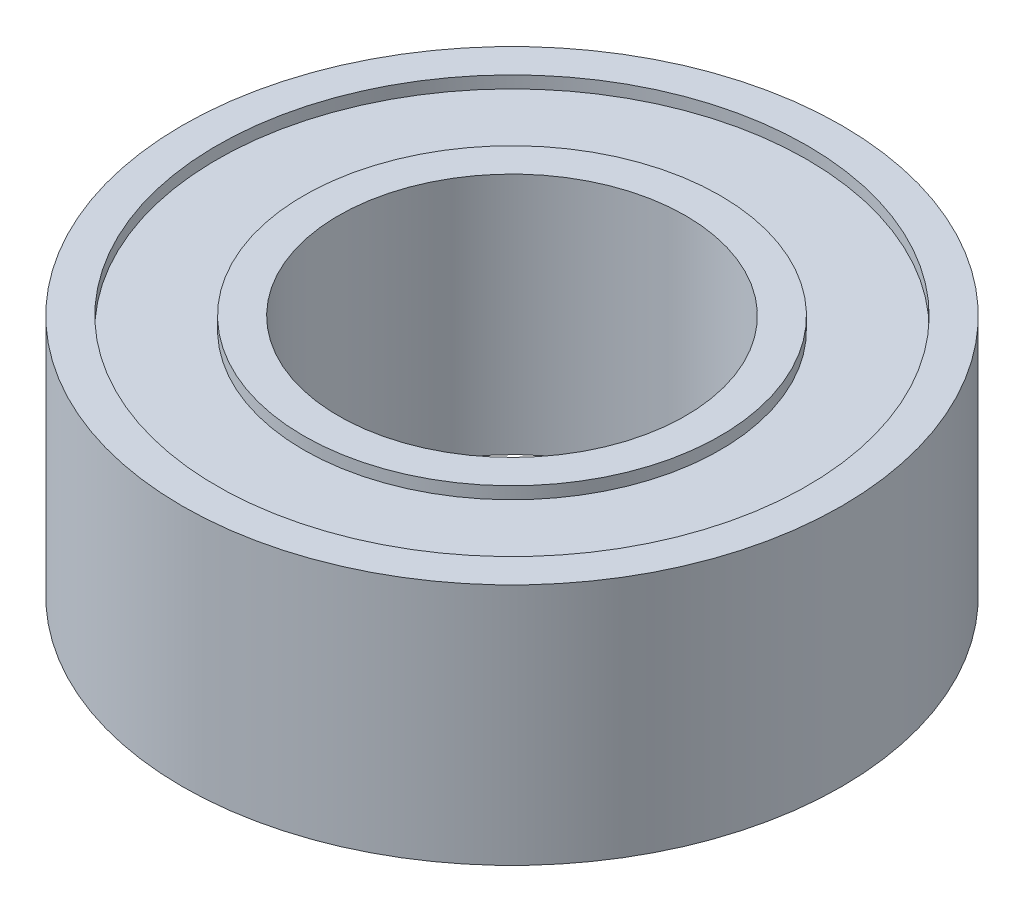
ISO-10303-21;
HEADER;
FILE_DESCRIPTION(('STEP AP214'),'2;1');
FILE_NAME('part.step','',(''),(''),'','','');
FILE_SCHEMA(('AUTOMOTIVE_DESIGN { 1 0 10303 214 1 1 1 1 }'));
ENDSEC;
DATA;
#1=APPLICATION_CONTEXT('core data for automotive mechanical design processes');
#2=APPLICATION_PROTOCOL_DEFINITION('international standard','automotive_design',2000,#1);
#3=PRODUCT_CONTEXT('',#1,'mechanical');
#4=PRODUCT('Part','Part','',(#3));
#5=PRODUCT_RELATED_PRODUCT_CATEGORY('part','',(#4));
#6=PRODUCT_DEFINITION_FORMATION('','',#4);
#7=PRODUCT_DEFINITION_CONTEXT('part definition',#1,'design');
#8=PRODUCT_DEFINITION('design','',#6,#7);
#9=PRODUCT_DEFINITION_SHAPE('','',#8);
#10=(LENGTH_UNIT() NAMED_UNIT(*) SI_UNIT(.MILLI.,.METRE.));
#11=(NAMED_UNIT(*) PLANE_ANGLE_UNIT() SI_UNIT($,.RADIAN.));
#12=(NAMED_UNIT(*) SI_UNIT($,.STERADIAN.) SOLID_ANGLE_UNIT());
#13=UNCERTAINTY_MEASURE_WITH_UNIT(LENGTH_MEASURE(1.E-05),#10,'distance_accuracy_value','');
#14=(GEOMETRIC_REPRESENTATION_CONTEXT(3) GLOBAL_UNCERTAINTY_ASSIGNED_CONTEXT((#13)) GLOBAL_UNIT_ASSIGNED_CONTEXT((#10,
#11,#12)) REPRESENTATION_CONTEXT('',''));
#15=CARTESIAN_POINT('',(0.,0.,0.));
#16=DIRECTION('',(0.,0.,1.));
#17=DIRECTION('',(1.,0.,0.));
#18=AXIS2_PLACEMENT_3D('',#15,#16,#17);
#19=CARTESIAN_POINT('',(5.,3.5,0.));
#20=DIRECTION('',(0.,1.,0.));
#21=DIRECTION('',(0.,0.,1.));
#22=AXIS2_PLACEMENT_3D('',#19,#20,#21);
#23=PLANE('',#22);
#24=CARTESIAN_POINT('',(0.,3.5,0.));
#25=DIRECTION('',(0.,-1.,0.));
#26=DIRECTION('',(0.,0.,-1.));
#27=AXIS2_PLACEMENT_3D('',#24,#25,#26);
#28=CIRCLE('',#27,5.);
#29=CARTESIAN_POINT('',(0.,3.5,-5.));
#30=VERTEX_POINT('',#29);
#31=EDGE_CURVE('E83',#30,#30,#28,.T.);
#32=ORIENTED_EDGE('',*,*,#31,.T.);
#33=EDGE_LOOP('',(#32));
#34=FACE_BOUND('',#33,.T.);
#35=CARTESIAN_POINT('',(0.,3.5,0.));
#36=DIRECTION('',(0.,-1.,0.));
#37=DIRECTION('',(0.,0.,-1.));
#38=AXIS2_PLACEMENT_3D('',#35,#36,#37);
#39=CIRCLE('',#38,6.);
#40=CARTESIAN_POINT('',(0.,3.5,-6.));
#41=VERTEX_POINT('',#40);
#42=EDGE_CURVE('E10',#41,#41,#39,.T.);
#43=ORIENTED_EDGE('',*,*,#42,.F.);
#44=EDGE_LOOP('',(#43));
#45=FACE_BOUND('',#44,.T.);
#46=ADVANCED_FACE('F44',(#34,#45),#23,.T.);
#47=CARTESIAN_POINT('',(0.,0.,0.));
#48=DIRECTION('',(0.,-1.,0.));
#49=DIRECTION('',(0.,0.,-1.));
#50=AXIS2_PLACEMENT_3D('',#47,#48,#49);
#51=CYLINDRICAL_SURFACE('',#50,6.);
#52=ORIENTED_EDGE('',*,*,#42,.T.);
#53=EDGE_LOOP('',(#52));
#54=FACE_BOUND('',#53,.T.);
#55=CARTESIAN_POINT('',(0.,3.15,0.));
#56=DIRECTION('',(0.,-1.,0.));
#57=DIRECTION('',(0.,0.,-1.));
#58=AXIS2_PLACEMENT_3D('',#55,#56,#57);
#59=CIRCLE('',#58,6.);
#60=CARTESIAN_POINT('',(0.,3.15,-6.));
#61=VERTEX_POINT('',#60);
#62=EDGE_CURVE('E51',#61,#61,#59,.T.);
#63=ORIENTED_EDGE('',*,*,#62,.F.);
#64=EDGE_LOOP('',(#63));
#65=FACE_BOUND('',#64,.T.);
#66=ADVANCED_FACE('F103',(#54,#65),#51,.T.);
#67=CARTESIAN_POINT('',(6.,3.15,0.));
#68=DIRECTION('',(0.,1.,0.));
#69=DIRECTION('',(0.,0.,1.));
#70=AXIS2_PLACEMENT_3D('',#67,#68,#69);
#71=PLANE('',#70);
#72=ORIENTED_EDGE('',*,*,#62,.T.);
#73=EDGE_LOOP('',(#72));
#74=FACE_BOUND('',#73,.T.);
#75=CARTESIAN_POINT('',(0.,3.15,0.));
#76=DIRECTION('',(0.,-1.,0.));
#77=DIRECTION('',(0.,0.,-1.));
#78=AXIS2_PLACEMENT_3D('',#75,#76,#77);
#79=CIRCLE('',#78,8.5);
#80=CARTESIAN_POINT('',(0.,3.15,-8.5));
#81=VERTEX_POINT('',#80);
#82=EDGE_CURVE('E54',#81,#81,#79,.T.);
#83=ORIENTED_EDGE('',*,*,#82,.F.);
#84=EDGE_LOOP('',(#83));
#85=FACE_BOUND('',#84,.T.);
#86=ADVANCED_FACE('F110',(#74,#85),#71,.T.);
#87=CARTESIAN_POINT('',(0.,0.,0.));
#88=DIRECTION('',(0.,-1.,0.));
#89=DIRECTION('',(0.,0.,-1.));
#90=AXIS2_PLACEMENT_3D('',#87,#88,#89);
#91=CYLINDRICAL_SURFACE('',#90,8.5);
#92=ORIENTED_EDGE('',*,*,#82,.T.);
#93=EDGE_LOOP('',(#92));
#94=FACE_BOUND('',#93,.T.);
#95=CARTESIAN_POINT('',(0.,3.5,0.));
#96=DIRECTION('',(0.,-1.,0.));
#97=DIRECTION('',(0.,0.,-1.));
#98=AXIS2_PLACEMENT_3D('',#95,#96,#97);
#99=CIRCLE('',#98,8.5);
#100=CARTESIAN_POINT('',(0.,3.5,-8.5));
#101=VERTEX_POINT('',#100);
#102=EDGE_CURVE('E56',#101,#101,#99,.T.);
#103=ORIENTED_EDGE('',*,*,#102,.F.);
#104=EDGE_LOOP('',(#103));
#105=FACE_BOUND('',#104,.T.);
#106=ADVANCED_FACE('F115',(#94,#105),#91,.F.);
#107=CARTESIAN_POINT('',(8.5,3.5,0.));
#108=DIRECTION('',(0.,1.,0.));
#109=DIRECTION('',(0.,0.,1.));
#110=AXIS2_PLACEMENT_3D('',#107,#108,#109);
#111=PLANE('',#110);
#112=ORIENTED_EDGE('',*,*,#102,.T.);
#113=EDGE_LOOP('',(#112));
#114=FACE_BOUND('',#113,.T.);
#115=CARTESIAN_POINT('',(0.,3.5,0.));
#116=DIRECTION('',(0.,-1.,0.));
#117=DIRECTION('',(0.,0.,-1.));
#118=AXIS2_PLACEMENT_3D('',#115,#116,#117);
#119=CIRCLE('',#118,9.5);
#120=CARTESIAN_POINT('',(0.,3.5,-9.5));
#121=VERTEX_POINT('',#120);
#122=EDGE_CURVE('E63',#121,#121,#119,.T.);
#123=ORIENTED_EDGE('',*,*,#122,.F.);
#124=EDGE_LOOP('',(#123));
#125=FACE_BOUND('',#124,.T.);
#126=ADVANCED_FACE('F119',(#114,#125),#111,.T.);
#127=CARTESIAN_POINT('',(0.,0.,0.));
#128=DIRECTION('',(0.,-1.,0.));
#129=DIRECTION('',(0.,0.,-1.));
#130=AXIS2_PLACEMENT_3D('',#127,#128,#129);
#131=CYLINDRICAL_SURFACE('',#130,9.5);
#132=ORIENTED_EDGE('',*,*,#122,.T.);
#133=EDGE_LOOP('',(#132));
#134=FACE_BOUND('',#133,.T.);
#135=CARTESIAN_POINT('',(0.,-3.5,0.));
#136=DIRECTION('',(0.,-1.,0.));
#137=DIRECTION('',(0.,0.,-1.));
#138=AXIS2_PLACEMENT_3D('',#135,#136,#137);
#139=CIRCLE('',#138,9.5);
#140=CARTESIAN_POINT('',(0.,-3.5,-9.5));
#141=VERTEX_POINT('',#140);
#142=EDGE_CURVE('E70',#141,#141,#139,.T.);
#143=ORIENTED_EDGE('',*,*,#142,.F.);
#144=EDGE_LOOP('',(#143));
#145=FACE_BOUND('',#144,.T.);
#146=ADVANCED_FACE('F125',(#134,#145),#131,.T.);
#147=CARTESIAN_POINT('',(8.5,-3.5,0.));
#148=DIRECTION('',(0.,-1.,0.));
#149=DIRECTION('',(0.,0.,-1.));
#150=AXIS2_PLACEMENT_3D('',#147,#148,#149);
#151=PLANE('',#150);
#152=ORIENTED_EDGE('',*,*,#142,.T.);
#153=EDGE_LOOP('',(#152));
#154=FACE_BOUND('',#153,.T.);
#155=CARTESIAN_POINT('',(0.,-3.5,0.));
#156=DIRECTION('',(0.,-1.,0.));
#157=DIRECTION('',(0.,0.,-1.));
#158=AXIS2_PLACEMENT_3D('',#155,#156,#157);
#159=CIRCLE('',#158,8.5);
#160=CARTESIAN_POINT('',(0.,-3.5,-8.5));
#161=VERTEX_POINT('',#160);
#162=EDGE_CURVE('E68',#161,#161,#159,.T.);
#163=ORIENTED_EDGE('',*,*,#162,.F.);
#164=EDGE_LOOP('',(#163));
#165=FACE_BOUND('',#164,.T.);
#166=ADVANCED_FACE('F127',(#154,#165),#151,.T.);
#167=CARTESIAN_POINT('',(0.,0.,0.));
#168=DIRECTION('',(0.,-1.,0.));
#169=DIRECTION('',(0.,0.,-1.));
#170=AXIS2_PLACEMENT_3D('',#167,#168,#169);
#171=CYLINDRICAL_SURFACE('',#170,8.5);
#172=ORIENTED_EDGE('',*,*,#162,.T.);
#173=EDGE_LOOP('',(#172));
#174=FACE_BOUND('',#173,.T.);
#175=CARTESIAN_POINT('',(0.,-3.15,0.));
#176=DIRECTION('',(0.,-1.,0.));
#177=DIRECTION('',(0.,0.,-1.));
#178=AXIS2_PLACEMENT_3D('',#175,#176,#177);
#179=CIRCLE('',#178,8.5);
#180=CARTESIAN_POINT('',(0.,-3.15,-8.5));
#181=VERTEX_POINT('',#180);
#182=EDGE_CURVE('E71',#181,#181,#179,.T.);
#183=ORIENTED_EDGE('',*,*,#182,.F.);
#184=EDGE_LOOP('',(#183));
#185=FACE_BOUND('',#184,.T.);
#186=ADVANCED_FACE('F128',(#174,#185),#171,.F.);
#187=CARTESIAN_POINT('',(6.,-3.15,0.));
#188=DIRECTION('',(0.,-1.,0.));
#189=DIRECTION('',(0.,0.,-1.));
#190=AXIS2_PLACEMENT_3D('',#187,#188,#189);
#191=PLANE('',#190);
#192=ORIENTED_EDGE('',*,*,#182,.T.);
#193=EDGE_LOOP('',(#192));
#194=FACE_BOUND('',#193,.T.);
#195=CARTESIAN_POINT('',(0.,-3.15,0.));
#196=DIRECTION('',(0.,-1.,0.));
#197=DIRECTION('',(0.,0.,-1.));
#198=AXIS2_PLACEMENT_3D('',#195,#196,#197);
#199=CIRCLE('',#198,6.);
#200=CARTESIAN_POINT('',(0.,-3.15,-6.));
#201=VERTEX_POINT('',#200);
#202=EDGE_CURVE('E76',#201,#201,#199,.T.);
#203=ORIENTED_EDGE('',*,*,#202,.F.);
#204=EDGE_LOOP('',(#203));
#205=FACE_BOUND('',#204,.T.);
#206=ADVANCED_FACE('F133',(#194,#205),#191,.T.);
#207=CARTESIAN_POINT('',(0.,0.,0.));
#208=DIRECTION('',(0.,-1.,0.));
#209=DIRECTION('',(0.,0.,-1.));
#210=AXIS2_PLACEMENT_3D('',#207,#208,#209);
#211=CYLINDRICAL_SURFACE('',#210,6.);
#212=ORIENTED_EDGE('',*,*,#202,.T.);
#213=EDGE_LOOP('',(#212));
#214=FACE_BOUND('',#213,.T.);
#215=CARTESIAN_POINT('',(0.,-3.5,0.));
#216=DIRECTION('',(0.,-1.,0.));
#217=DIRECTION('',(0.,0.,-1.));
#218=AXIS2_PLACEMENT_3D('',#215,#216,#217);
#219=CIRCLE('',#218,6.);
#220=CARTESIAN_POINT('',(0.,-3.5,-6.));
#221=VERTEX_POINT('',#220);
#222=EDGE_CURVE('E78',#221,#221,#219,.T.);
#223=ORIENTED_EDGE('',*,*,#222,.F.);
#224=EDGE_LOOP('',(#223));
#225=FACE_BOUND('',#224,.T.);
#226=ADVANCED_FACE('F97',(#214,#225),#211,.T.);
#227=CARTESIAN_POINT('',(5.,-3.5,0.));
#228=DIRECTION('',(0.,-1.,0.));
#229=DIRECTION('',(0.,0.,-1.));
#230=AXIS2_PLACEMENT_3D('',#227,#228,#229);
#231=PLANE('',#230);
#232=ORIENTED_EDGE('',*,*,#222,.T.);
#233=EDGE_LOOP('',(#232));
#234=FACE_BOUND('',#233,.T.);
#235=CARTESIAN_POINT('',(0.,-3.5,0.));
#236=DIRECTION('',(0.,-1.,0.));
#237=DIRECTION('',(0.,0.,-1.));
#238=AXIS2_PLACEMENT_3D('',#235,#236,#237);
#239=CIRCLE('',#238,5.);
#240=CARTESIAN_POINT('',(0.,-3.5,-5.));
#241=VERTEX_POINT('',#240);
#242=EDGE_CURVE('E85',#241,#241,#239,.T.);
#243=ORIENTED_EDGE('',*,*,#242,.F.);
#244=EDGE_LOOP('',(#243));
#245=FACE_BOUND('',#244,.T.);
#246=ADVANCED_FACE('F91',(#234,#245),#231,.T.);
#247=CARTESIAN_POINT('',(0.,0.,0.));
#248=DIRECTION('',(0.,-1.,0.));
#249=DIRECTION('',(0.,0.,-1.));
#250=AXIS2_PLACEMENT_3D('',#247,#248,#249);
#251=CYLINDRICAL_SURFACE('',#250,5.);
#252=ORIENTED_EDGE('',*,*,#242,.T.);
#253=EDGE_LOOP('',(#252));
#254=FACE_BOUND('',#253,.T.);
#255=ORIENTED_EDGE('',*,*,#31,.F.);
#256=EDGE_LOOP('',(#255));
#257=FACE_BOUND('',#256,.T.);
#258=ADVANCED_FACE('F93',(#254,#257),#251,.F.);
#259=CLOSED_SHELL('',(#46,#66,#86,#106,#126,#146,#166,#186,#206,#226,#246,#258));
#260=MANIFOLD_SOLID_BREP('B2',#259);
#261=ADVANCED_BREP_SHAPE_REPRESENTATION('',(#18,#260),#14);
#262=SHAPE_DEFINITION_REPRESENTATION(#9,#261);
ENDSEC;
END-ISO-10303-21;
